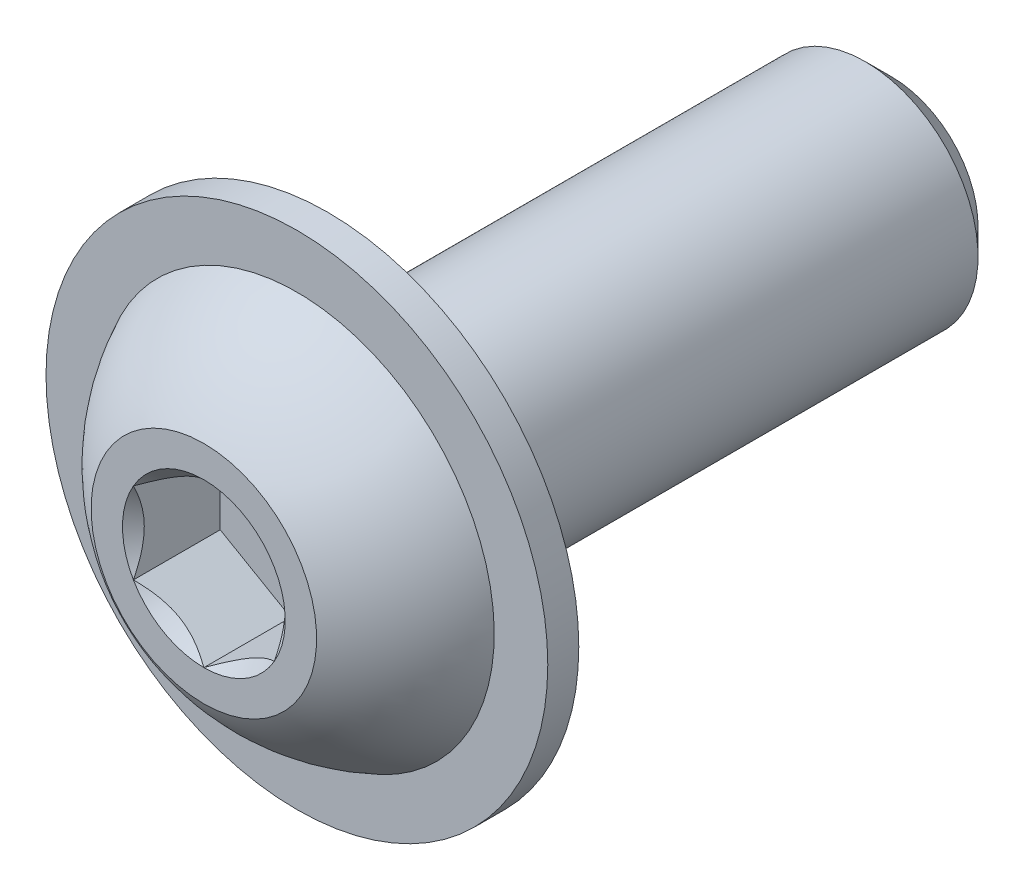
ISO-10303-21;
HEADER;
FILE_DESCRIPTION(('STEP AP214'),'2;1');
FILE_NAME('part.step','',(''),(''),'','','');
FILE_SCHEMA(('AUTOMOTIVE_DESIGN { 1 0 10303 214 1 1 1 1 }'));
ENDSEC;
DATA;
#1=APPLICATION_CONTEXT('core data for automotive mechanical design processes');
#2=APPLICATION_PROTOCOL_DEFINITION('international standard','automotive_design',2000,#1);
#3=PRODUCT_CONTEXT('',#1,'mechanical');
#4=PRODUCT('Part','Part','',(#3));
#5=PRODUCT_RELATED_PRODUCT_CATEGORY('part','',(#4));
#6=PRODUCT_DEFINITION_FORMATION('','',#4);
#7=PRODUCT_DEFINITION_CONTEXT('part definition',#1,'design');
#8=PRODUCT_DEFINITION('design','',#6,#7);
#9=PRODUCT_DEFINITION_SHAPE('','',#8);
#10=(LENGTH_UNIT() NAMED_UNIT(*) SI_UNIT(.MILLI.,.METRE.));
#11=(NAMED_UNIT(*) PLANE_ANGLE_UNIT() SI_UNIT($,.RADIAN.));
#12=(NAMED_UNIT(*) SI_UNIT($,.STERADIAN.) SOLID_ANGLE_UNIT());
#13=UNCERTAINTY_MEASURE_WITH_UNIT(LENGTH_MEASURE(1.E-05),#10,'distance_accuracy_value','');
#14=(GEOMETRIC_REPRESENTATION_CONTEXT(3) GLOBAL_UNCERTAINTY_ASSIGNED_CONTEXT((#13)) GLOBAL_UNIT_ASSIGNED_CONTEXT((#10,
#11,#12)) REPRESENTATION_CONTEXT('',''));
#15=CARTESIAN_POINT('',(0.,0.,0.));
#16=DIRECTION('',(0.,0.,1.));
#17=DIRECTION('',(1.,0.,0.));
#18=AXIS2_PLACEMENT_3D('',#15,#16,#17);
#19=CARTESIAN_POINT('',(0.,-4.,-24.3999999999991));
#20=DIRECTION('',(0.,0.,-1.));
#21=DIRECTION('',(0.,1.,0.));
#22=AXIS2_PLACEMENT_3D('',#19,#20,#21);
#23=PLANE('',#22);
#24=CARTESIAN_POINT('',(0.,0.,-24.4));
#25=DIRECTION('',(0.,0.,-1.));
#26=DIRECTION('',(0.,1.,0.));
#27=AXIS2_PLACEMENT_3D('',#24,#25,#26);
#28=CIRCLE('',#27,3.06250000000001);
#29=CARTESIAN_POINT('',(0.,3.06250000000001,-24.4));
#30=VERTEX_POINT('',#29);
#31=EDGE_CURVE('E209',#30,#30,#28,.T.);
#32=ORIENTED_EDGE('',*,*,#31,.T.);
#33=EDGE_LOOP('',(#32));
#34=FACE_BOUND('',#33,.T.);
#35=ADVANCED_FACE('F40',(#34),#23,.T.);
#36=CARTESIAN_POINT('',(0.,0.,-24.4));
#37=DIRECTION('',(0.,0.,-1.));
#38=DIRECTION('',(0.,1.,0.));
#39=AXIS2_PLACEMENT_3D('',#36,#37,#38);
#40=CYLINDRICAL_SURFACE('',#39,4.);
#41=CARTESIAN_POINT('',(0.,0.,-23.4624999999999));
#42=DIRECTION('',(0.,0.,-1.));
#43=DIRECTION('',(0.,1.,0.));
#44=AXIS2_PLACEMENT_3D('',#41,#42,#43);
#45=CIRCLE('',#44,4.);
#46=CARTESIAN_POINT('',(0.,4.,-23.4624999999999));
#47=VERTEX_POINT('',#46);
#48=EDGE_CURVE('E55',#47,#47,#45,.F.);
#49=ORIENTED_EDGE('',*,*,#48,.T.);
#50=EDGE_LOOP('',(#49));
#51=FACE_BOUND('',#50,.T.);
#52=CARTESIAN_POINT('',(0.,0.,-4.39999999999996));
#53=DIRECTION('',(0.,0.,1.));
#54=DIRECTION('',(1.,0.,0.));
#55=AXIS2_PLACEMENT_3D('',#52,#53,#54);
#56=CIRCLE('',#55,4.);
#57=CARTESIAN_POINT('',(4.,0.,-4.39999999999996));
#58=VERTEX_POINT('',#57);
#59=EDGE_CURVE('E205',#58,#58,#56,.F.);
#60=ORIENTED_EDGE('',*,*,#59,.T.);
#61=EDGE_LOOP('',(#60));
#62=FACE_BOUND('',#61,.T.);
#63=ADVANCED_FACE('F217',(#51,#62),#40,.T.);
#64=CARTESIAN_POINT('',(0.,0.,-24.4));
#65=DIRECTION('',(0.,0.,1.));
#66=DIRECTION('',(0.,-1.,0.));
#67=AXIS2_PLACEMENT_3D('',#64,#65,#66);
#68=CONICAL_SURFACE('',#67,3.06250000000001,0.785398163397445);
#69=ORIENTED_EDGE('',*,*,#48,.F.);
#70=EDGE_LOOP('',(#69));
#71=FACE_BOUND('',#70,.T.);
#72=ORIENTED_EDGE('',*,*,#31,.F.);
#73=EDGE_LOOP('',(#72));
#74=FACE_BOUND('',#73,.T.);
#75=ADVANCED_FACE('F42',(#71,#74),#68,.T.);
#76=CARTESIAN_POINT('',(0.,-7.00000000000001,-4.40000000000085));
#77=DIRECTION('',(0.,0.,1.));
#78=DIRECTION('',(1.,0.,0.));
#79=AXIS2_PLACEMENT_3D('',#76,#77,#78);
#80=PLANE('',#79);
#81=ORIENTED_EDGE('',*,*,#59,.F.);
#82=EDGE_LOOP('',(#81));
#83=FACE_BOUND('',#82,.T.);
#84=CARTESIAN_POINT('',(0.,0.,-4.39999999999996));
#85=DIRECTION('',(0.,0.,-1.));
#86=DIRECTION('',(-1.,0.,0.));
#87=AXIS2_PLACEMENT_3D('',#84,#85,#86);
#88=CIRCLE('',#87,8.9);
#89=CARTESIAN_POINT('',(-8.9,0.,-4.39999999999996));
#90=VERTEX_POINT('',#89);
#91=EDGE_CURVE('E194',#90,#90,#88,.T.);
#92=ORIENTED_EDGE('',*,*,#91,.T.);
#93=EDGE_LOOP('',(#92));
#94=FACE_BOUND('',#93,.T.);
#95=ADVANCED_FACE('F222',(#83,#94),#80,.F.);
#96=CARTESIAN_POINT('',(0.,0.,-3.29999999999997));
#97=DIRECTION('',(0.,0.,-1.));
#98=DIRECTION('',(-1.,0.,0.));
#99=AXIS2_PLACEMENT_3D('',#96,#97,#98);
#100=PLANE('',#99);
#101=CARTESIAN_POINT('',(0.,0.,-3.29999999999997));
#102=DIRECTION('',(0.,0.,-1.));
#103=DIRECTION('',(-1.,0.,0.));
#104=AXIS2_PLACEMENT_3D('',#101,#102,#103);
#105=CIRCLE('',#104,8.9);
#106=CARTESIAN_POINT('',(-8.9,0.,-3.29999999999997));
#107=VERTEX_POINT('',#106);
#108=EDGE_CURVE('E189',#107,#107,#105,.T.);
#109=ORIENTED_EDGE('',*,*,#108,.F.);
#110=EDGE_LOOP('',(#109));
#111=FACE_BOUND('',#110,.T.);
#112=CARTESIAN_POINT('',(0.,0.,-3.29999999999997));
#113=DIRECTION('',(0.,0.,-1.));
#114=DIRECTION('',(-1.,0.,0.));
#115=AXIS2_PLACEMENT_3D('',#112,#113,#114);
#116=CIRCLE('',#115,7.);
#117=CARTESIAN_POINT('',(0.,-6.99999999999996,-3.29999999999997));
#118=VERTEX_POINT('',#117);
#119=EDGE_CURVE('E193',#118,#118,#116,.T.);
#120=ORIENTED_EDGE('',*,*,#119,.T.);
#121=EDGE_LOOP('',(#120));
#122=FACE_BOUND('',#121,.T.);
#123=ADVANCED_FACE('F240',(#111,#122),#100,.F.);
#124=CARTESIAN_POINT('',(0.,0.,-3.29999999999997));
#125=DIRECTION('',(0.,0.,-1.));
#126=DIRECTION('',(-1.,0.,0.));
#127=AXIS2_PLACEMENT_3D('',#124,#125,#126);
#128=CYLINDRICAL_SURFACE('',#127,8.9);
#129=ORIENTED_EDGE('',*,*,#108,.T.);
#130=EDGE_LOOP('',(#129));
#131=FACE_BOUND('',#130,.T.);
#132=ORIENTED_EDGE('',*,*,#91,.F.);
#133=EDGE_LOOP('',(#132));
#134=FACE_BOUND('',#133,.T.);
#135=ADVANCED_FACE('F237',(#131,#134),#128,.T.);
#136=CARTESIAN_POINT('',(0.,-4.,8.88178419700125E-13));
#137=DIRECTION('',(0.,0.,-1.));
#138=DIRECTION('',(-1.,0.,0.));
#139=AXIS2_PLACEMENT_3D('',#136,#137,#138);
#140=PLANE('',#139);
#141=CARTESIAN_POINT('',(0.,0.,0.));
#142=DIRECTION('',(0.,0.,1.));
#143=DIRECTION('',(1.,0.,0.));
#144=AXIS2_PLACEMENT_3D('',#141,#142,#143);
#145=CIRCLE('',#144,2.88675134594813);
#146=CARTESIAN_POINT('',(-2.50000000000011,1.44337567297405,-8.88178419700125E-13));
#147=VERTEX_POINT('',#146);
#148=CARTESIAN_POINT('',(-2.5,-1.44337567297408,8.88178419700125E-13));
#149=VERTEX_POINT('',#148);
#150=EDGE_CURVE('E68',#147,#149,#145,.T.);
#151=ORIENTED_EDGE('',*,*,#150,.F.);
#152=CARTESIAN_POINT('',(0.,2.88675134594816,8.88178419700125E-13));
#153=VERTEX_POINT('',#152);
#154=EDGE_CURVE('E146',#153,#147,#145,.T.);
#155=ORIENTED_EDGE('',*,*,#154,.F.);
#156=CARTESIAN_POINT('',(2.49999999999989,1.44337567297406,-8.88178419700125E-13));
#157=VERTEX_POINT('',#156);
#158=EDGE_CURVE('E140',#157,#153,#145,.T.);
#159=ORIENTED_EDGE('',*,*,#158,.F.);
#160=CARTESIAN_POINT('',(2.5,-1.44337567297407,8.88178419700125E-13));
#161=VERTEX_POINT('',#160);
#162=EDGE_CURVE('E109',#161,#157,#145,.T.);
#163=ORIENTED_EDGE('',*,*,#162,.F.);
#164=CARTESIAN_POINT('',(0.,-2.88675134594812,-8.88178419700125E-13));
#165=VERTEX_POINT('',#164);
#166=EDGE_CURVE('E100',#165,#161,#145,.T.);
#167=ORIENTED_EDGE('',*,*,#166,.F.);
#168=EDGE_CURVE('E61',#149,#165,#145,.T.);
#169=ORIENTED_EDGE('',*,*,#168,.F.);
#170=EDGE_LOOP('',(#151,#155,#159,#163,#167,#169));
#171=FACE_BOUND('',#170,.T.);
#172=CARTESIAN_POINT('',(0.,0.,0.));
#173=DIRECTION('',(0.,0.,1.));
#174=DIRECTION('',(1.,0.,0.));
#175=AXIS2_PLACEMENT_3D('',#172,#173,#174);
#176=CIRCLE('',#175,4.);
#177=CARTESIAN_POINT('',(0.,-3.99999999999992,0.));
#178=VERTEX_POINT('',#177);
#179=EDGE_CURVE('E201',#178,#178,#176,.T.);
#180=ORIENTED_EDGE('',*,*,#179,.T.);
#181=EDGE_LOOP('',(#180));
#182=FACE_BOUND('',#181,.T.);
#183=ADVANCED_FACE('F137',(#171,#182),#140,.F.);
#184=CARTESIAN_POINT('',(0.,0.,-6.65000000000004));
#185=DIRECTION('',(0.,0.,1.));
#186=DIRECTION('',(0.,-1.,0.));
#187=AXIS2_PLACEMENT_3D('',#184,#185,#186);
#188=SPHERICAL_SURFACE('',#187,7.76031571522705);
#189=CARTESIAN_POINT('',(0.,-3.99999999999992,0.));
#190=CARTESIAN_POINT('',(0.,-4.04037893719837,-0.0242880228539734));
#191=CARTESIAN_POINT('',(0.,-4.08053660493605,-0.0489439030561398));
#192=CARTESIAN_POINT('',(0.,-4.16039619582756,-0.0989830066171534));
#193=CARTESIAN_POINT('',(0.,-4.20009811898139,-0.124366229976001));
#194=CARTESIAN_POINT('',(0.,-4.2790330150429,-0.175851648310668));
#195=CARTESIAN_POINT('',(0.,-4.31826598795057,-0.201953843286489));
#196=CARTESIAN_POINT('',(0.,-4.39624997398239,-0.254868530081802));
#197=CARTESIAN_POINT('',(0.,-4.43500098710654,-0.281681021901295));
#198=CARTESIAN_POINT('',(0.,-4.51200819309826,-0.336007409250989));
#199=CARTESIAN_POINT('',(0.,-4.55026438596583,-0.363521304781191));
#200=CARTESIAN_POINT('',(0.,-4.62626925806947,-0.419241369039924));
#201=CARTESIAN_POINT('',(0.,-4.66401793730553,-0.447447537768455));
#202=CARTESIAN_POINT('',(0.,-4.73899525639249,-0.504542789448706));
#203=CARTESIAN_POINT('',(0.,-4.77622389624339,-0.533431872400427));
#204=CARTESIAN_POINT('',(0.,-4.85014878357225,-0.59188336661719));
#205=CARTESIAN_POINT('',(0.,-4.88684503105021,-0.621445777882233));
#206=CARTESIAN_POINT('',(0.,-4.9596929572454,-0.681234119484463));
#207=CARTESIAN_POINT('',(0.,-4.99584463596261,-0.71146004982165));
#208=CARTESIAN_POINT('',(0.,-5.06759142895973,-0.772565400137288));
#209=CARTESIAN_POINT('',(0.,-5.10318654323964,-0.803444820115739));
#210=CARTESIAN_POINT('',(0.,-5.17380839635813,-0.865846903451576));
#211=CARTESIAN_POINT('',(0.,-5.20883513519672,-0.897369566808963));
#212=CARTESIAN_POINT('',(0.,-5.27830861502532,-0.961047677200643));
#213=CARTESIAN_POINT('',(0.,-5.31275535601533,-0.993203124234936));
#214=CARTESIAN_POINT('',(0.,-5.38105741019139,-1.05813613231156));
#215=CARTESIAN_POINT('',(0.,-5.41491272337744,-1.09091369335389));
#216=CARTESIAN_POINT('',(0.,-5.48202068823502,-1.15708005335065));
#217=CARTESIAN_POINT('',(0.,-5.51527333990657,-1.19046885230509));
#218=CARTESIAN_POINT('',(0.,-5.58116494799691,-1.25784660921207));
#219=CARTESIAN_POINT('',(0.,-5.61380390441571,-1.29183556716463));
#220=CARTESIAN_POINT('',(0.,-5.67845729189579,-1.36040236401193));
#221=CARTESIAN_POINT('',(0.,-5.71047172295708,-1.39498020290667));
#222=CARTESIAN_POINT('',(0.,-5.77386543684441,-1.46471328818274));
#223=CARTESIAN_POINT('',(0.,-5.80524471967046,-1.49986853456406));
#224=CARTESIAN_POINT('',(0.,-5.86735772496153,-1.57074476976501));
#225=CARTESIAN_POINT('',(0.,-5.89809144742654,-1.60646575858465));
#226=CARTESIAN_POINT('',(0.,-5.95890313407649,-1.67846162589199));
#227=CARTESIAN_POINT('',(0.,-5.98898109826144,-1.71473650437969));
#228=CARTESIAN_POINT('',(0.,-6.04847128802288,-1.78782811446386));
#229=CARTESIAN_POINT('',(0.,-6.07788351359938,-1.82464484606033));
#230=CARTESIAN_POINT('',(0.,-6.13603246671775,-1.89880794600757));
#231=CARTESIAN_POINT('',(0.,-6.16476919425962,-1.93615431435836));
#232=CARTESIAN_POINT('',(0.,-6.22155761602329,-2.01136429571816));
#233=CARTESIAN_POINT('',(0.,-6.24960931024508,-2.04922790872719));
#234=CARTESIAN_POINT('',(0.,-6.30501835738714,-2.12545981567796));
#235=CARTESIAN_POINT('',(0.,-6.33237571030742,-2.16382810961971));
#236=CARTESIAN_POINT('',(0.,-6.38638699725991,-2.24105664724864));
#237=CARTESIAN_POINT('',(0.,-6.41304093129213,-2.27991689093583));
#238=CARTESIAN_POINT('',(0.,-6.46563653628033,-2.35811643363532));
#239=CARTESIAN_POINT('',(0.,-6.49157820723631,-2.39745573264761));
#240=CARTESIAN_POINT('',(0.,-6.5427406782489,-2.47660033260644));
#241=CARTESIAN_POINT('',(0.,-6.5679614783055,-2.51640563355297));
#242=CARTESIAN_POINT('',(0.,-6.61767383879795,-2.59646902941006));
#243=CARTESIAN_POINT('',(0.,-6.64216539923378,-2.63672712432062));
#244=CARTESIAN_POINT('',(0.,-6.69041115408783,-2.71768274971534));
#245=CARTESIAN_POINT('',(0.,-6.71416534850605,-2.7583802801995));
#246=CARTESIAN_POINT('',(0.,-6.76092848828481,-2.84020127319734));
#247=CARTESIAN_POINT('',(0.,-6.78393743364536,-2.88132473571101));
#248=CARTESIAN_POINT('',(0.,-6.82920244445215,-2.96398394543817));
#249=CARTESIAN_POINT('',(0.,-6.8514585098984,-3.00551969265166));
#250=CARTESIAN_POINT('',(0.,-6.89521036155603,-3.08898969680803));
#251=CARTESIAN_POINT('',(0.,-6.91670614776741,-3.13092395375092));
#252=CARTESIAN_POINT('',(0.,-6.95893036213258,-3.21517703597225));
#253=CARTESIAN_POINT('',(0.,-6.97965879028636,-3.25749586125068));
#254=CARTESIAN_POINT('',(0.,-6.99999999999996,-3.29999999999997));
#255=B_SPLINE_CURVE_WITH_KNOTS('',3,(#189,#190,#191,#192,#193,#194,#195,#196,#197,#198,#199,
#200,#201,#202,#203,#204,#205,#206,#207,#208,#209,#210,#211,#212,#213,#214,#215,#216,#217,#218,
#219,#220,#221,#222,#223,#224,#225,#226,#227,#228,#229,#230,#231,#232,#233,#234,#235,#236,#237,
#238,#239,#240,#241,#242,#243,#244,#245,#246,#247,#248,#249,#250,#251,#252,#253,#254),
.UNSPECIFIED.,.F.,.F.,(4,2,2,2,2,2,2,2,2,2,2,2,2,2,2,2,2,2,2,2,2,2,2,2,2,2,2,2,2,2,2,2,4),(0.,
0.141360341936276,0.282720683872553,0.424081025808828,0.565441367745104,0.70680170968138,
0.848162051617657,0.989522393553932,1.13088273549021,1.27224307742648,1.41360341936276,
1.55496376129904,1.69632410323531,1.83768444517159,1.97904478710786,2.12040512904414,
2.26176547098042,2.40312581291669,2.54448615485297,2.68584649678925,2.82720683872552,
2.9685671806618,3.10992752259807,3.25128786453435,3.39264820647063,3.5340085484069,
3.67536889034318,3.81672923227945,3.95808957421573,4.099449916152,4.24081025808828,
4.38217060002456,4.52353094196083),.UNSPECIFIED.);
#256=EDGE_CURVE('BSEAM231',#178,#118,#255,.T.);
#257=ORIENTED_EDGE('',*,*,#179,.F.);
#258=ORIENTED_EDGE('',*,*,#119,.F.);
#259=ORIENTED_EDGE('',*,*,#256,.T.);
#260=ORIENTED_EDGE('',*,*,#256,.F.);
#261=EDGE_LOOP('',(#257,#259,#258,#260));
#262=FACE_BOUND('',#261,.T.);
#263=ADVANCED_FACE('F231',(#262),#188,.T.);
#264=CARTESIAN_POINT('',(0.,0.,0.));
#265=DIRECTION('',(0.,0.,1.));
#266=DIRECTION('',(1.,0.,0.));
#267=AXIS2_PLACEMENT_3D('',#264,#265,#266);
#268=CONICAL_SURFACE('',#267,2.88675134594813,0.78539816339745);
#269=ORIENTED_EDGE('',*,*,#162,.T.);
#270=CARTESIAN_POINT('',(2.49999999999995,-2.87868021616153,0.925964193783768));
#271=CARTESIAN_POINT('',(2.49999999999998,-2.80858751756327,0.873054769398976));
#272=CARTESIAN_POINT('',(2.5,-2.7381023738442,0.820656784806086));
#273=CARTESIAN_POINT('',(2.50000000000001,-2.59619238907424,0.717112683514978));
#274=CARTESIAN_POINT('',(2.5,-2.52476731657101,0.665966884377655));
#275=CARTESIAN_POINT('',(2.5,-2.38030019419654,0.564792497981109));
#276=CARTESIAN_POINT('',(2.5,-2.30724990359351,0.514775637784124));
#277=CARTESIAN_POINT('',(2.5,-2.15990937397237,0.416608843915139));
#278=CARTESIAN_POINT('',(2.5,-2.08561922308883,0.368458778345149));
#279=CARTESIAN_POINT('',(2.5,-1.93130274871346,0.271746559451584));
#280=CARTESIAN_POINT('',(2.5,-1.85119168497788,0.223318932536946));
#281=CARTESIAN_POINT('',(2.5,-1.68912282627111,0.129664059703807));
#282=CARTESIAN_POINT('',(2.5,-1.60716527674811,0.0844363916944692));
#283=CARTESIAN_POINT('',(2.5,-1.44137668632267,-0.0018646253309174));
#284=CARTESIAN_POINT('',(2.5,-1.35755175925741,-0.0429496273364084));
#285=CARTESIAN_POINT('',(2.5,-1.18761577759393,-0.12003813389378));
#286=CARTESIAN_POINT('',(2.5,-1.10150577924733,-0.15604393926639));
#287=CARTESIAN_POINT('',(2.5,-0.933895283730512,-0.219050255715741));
#288=CARTESIAN_POINT('',(2.5,-0.852581486652385,-0.246542279857143));
#289=CARTESIAN_POINT('',(2.5,-0.687996185051314,-0.2950028855824));
#290=CARTESIAN_POINT('',(2.5,-0.60472454608513,-0.315971017760989));
#291=CARTESIAN_POINT('',(2.50000000000001,-0.438105786501689,-0.349940004987016));
#292=CARTESIAN_POINT('',(2.50000000000002,-0.354786957377915,-0.36307736655639));
#293=CARTESIAN_POINT('',(2.49999999999999,-0.187258638268824,-0.381129805600387));
#294=CARTESIAN_POINT('',(2.49999999999995,-0.103049303891809,-0.386046296469852));
#295=CARTESIAN_POINT('',(2.49999999999995,0.0623819458554584,-0.38729192562813));
#296=CARTESIAN_POINT('',(2.49999999999999,0.143601667742413,-0.383925448289126));
#297=CARTESIAN_POINT('',(2.50000000000002,0.30534484053391,-0.369462407619084));
#298=CARTESIAN_POINT('',(2.50000000000001,0.385868223029619,-0.358365093346914));
#299=CARTESIAN_POINT('',(2.5,0.546999992477707,-0.328857921414663));
#300=CARTESIAN_POINT('',(2.49999999999999,0.627585258156355,-0.310323623169074));
#301=CARTESIAN_POINT('',(2.50000000000001,0.786991930978571,-0.266927667985948));
#302=CARTESIAN_POINT('',(2.50000000000005,0.865813485110817,-0.24206654048261));
#303=CARTESIAN_POINT('',(2.50000000000008,1.11399280220491,-0.154441088760227));
#304=CARTESIAN_POINT('',(2.50000000000002,1.27984027529454,-0.0816966645254097));
#305=CARTESIAN_POINT('',(2.49999999999999,1.52253018655035,0.0395423452678388));
#306=CARTESIAN_POINT('',(2.5,1.60256472908877,0.0820714512071933));
#307=CARTESIAN_POINT('',(2.5,1.76081489282122,0.170396524152179));
#308=CARTESIAN_POINT('',(2.5,1.83903083842885,0.216191902476703));
#309=CARTESIAN_POINT('',(2.5,1.9900068460717,0.308044678728662));
#310=CARTESIAN_POINT('',(2.5,2.0628447203045,0.353975635424493));
#311=CARTESIAN_POINT('',(2.5,2.20727164736148,0.447770245386598));
#312=CARTESIAN_POINT('',(2.5,2.27886060500418,0.495634045043748));
#313=CARTESIAN_POINT('',(2.5,2.42037078548428,0.592552236318488));
#314=CARTESIAN_POINT('',(2.5,2.49030083172909,0.641593798316355));
#315=CARTESIAN_POINT('',(2.5,2.62920524991588,0.740973835190077));
#316=CARTESIAN_POINT('',(2.5,2.69817987937863,0.791311949707866));
#317=CARTESIAN_POINT('',(2.5,2.76675463365827,0.842180297683237));
#318=B_SPLINE_CURVE_WITH_KNOTS('',3,(#270,#271,#272,#273,#274,#275,#276,#277,#278,#279,#280,
#281,#282,#283,#284,#285,#286,#287,#288,#289,#290,#291,#292,#293,#294,#295,#296,#297,#298,#299,
#300,#301,#302,#303,#304,#305,#306,#307,#308,#309,#310,#311,#312,#313,#314,#315,#316,#317),
.UNSPECIFIED.,.F.,.F.,(4,2,2,2,2,2,2,2,2,2,2,2,2,2,2,2,2,2,2,2,2,2,2,4),(0.,0.263465914971081,
0.526997968323202,0.792571943279461,1.05812711983793,1.33890112548033,1.61963802629085,
1.89956181222208,2.17935838571868,2.43663887682558,2.69393708705198,2.94660788173083,
3.19923523084958,3.44271854486731,3.68622551313309,3.93398926860523,4.18173229781918,
4.72334004841857,4.99521600381964,5.26704308216917,5.52534341671957,5.78366335141064,
6.03988492204037,6.29603603207544),.UNSPECIFIED.);
#319=EDGE_CURVE('E11',#161,#157,#318,.T.);
#320=ORIENTED_EDGE('',*,*,#319,.F.);
#321=EDGE_LOOP('',(#269,#320));
#322=FACE_BOUND('',#321,.T.);
#323=ADVANCED_FACE('F113',(#322),#268,.F.);
#324=ORIENTED_EDGE('',*,*,#158,.T.);
#325=CARTESIAN_POINT('',(2.5001999999999,1.44326020292022,0.000115476980866447));
#326=CARTESIAN_POINT('',(2.41426172221201,1.4928766907347,-0.0494592946458244));
#327=CARTESIAN_POINT('',(2.32688643272399,1.54332283764112,-0.096122518637811));
#328=CARTESIAN_POINT('',(2.14871854383426,1.64618811625255,-0.181561859961724));
#329=CARTESIAN_POINT('',(2.05790899931892,1.69861703122348,-0.220290437593975));
#330=CARTESIAN_POINT('',(1.87479587687323,1.80433744175963,-0.286633296102404));
#331=CARTESIAN_POINT('',(1.78253893547082,1.85760201171289,-0.314414331469484));
#332=CARTESIAN_POINT('',(1.59599399122384,1.96530378548994,-0.357216824089123));
#333=CARTESIAN_POINT('',(1.50171168743379,2.01973769896305,-0.372270233327693));
#334=CARTESIAN_POINT('',(1.33922174170813,2.11355131286833,-0.385852277789835));
#335=CARTESIAN_POINT('',(1.27122403211978,2.15280980880335,-0.387862900759099));
#336=CARTESIAN_POINT('',(1.13533975883066,2.2312626305654,-0.38447588281283));
#337=CARTESIAN_POINT('',(1.06745324244764,2.27045692907351,-0.379075644700334));
#338=CARTESIAN_POINT('',(0.932321211763779,2.34847544336499,-0.361174211597577));
#339=CARTESIAN_POINT('',(0.865076500246328,2.38729919566115,-0.348665072953631));
#340=CARTESIAN_POINT('',(0.731749899181733,2.46427534467596,-0.317232498044382));
#341=CARTESIAN_POINT('',(0.665667920900315,2.50242779262538,-0.298309553503184));
#342=CARTESIAN_POINT('',(0.4964036533087,2.60015256308363,-0.242132638591658));
#343=CARTESIAN_POINT('',(0.394270877776981,2.65911894852986,-0.200644168403784));
#344=CARTESIAN_POINT('',(0.244093585059233,2.74582384890658,-0.130605953276968));
#345=CARTESIAN_POINT('',(0.194603460117082,2.77439698586415,-0.105997747884004));
#346=CARTESIAN_POINT('',(0.0965399361608538,2.831013987818,-0.0545381132846237));
#347=CARTESIAN_POINT('',(0.0479659965028322,2.85905816495519,-0.0276880612202618));
#348=CARTESIAN_POINT('',(-0.000200000000061262,2.88686681600198,0.000115476982642804));
#349=B_SPLINE_CURVE_WITH_KNOTS('',3,(#325,#326,#327,#328,#329,#330,#331,#332,#333,#334,#335,
#336,#337,#338,#339,#340,#341,#342,#343,#344,#345,#346,#347,#348),.UNSPECIFIED.,.F.,.F.,(4,2,2,
2,2,2,2,2,2,2,2,4),(0.,0.333012085133742,0.66796451830077,0.997597032042642,1.32639954393789,
1.56169424147123,1.79707142102041,2.03271213522123,2.26833478775603,2.642602408095,
2.82922877818843,3.01574133749021),.UNSPECIFIED.);
#350=EDGE_CURVE('E145',#157,#153,#349,.T.);
#351=ORIENTED_EDGE('',*,*,#350,.F.);
#352=EDGE_LOOP('',(#324,#351));
#353=FACE_BOUND('',#352,.T.);
#354=ADVANCED_FACE('F340',(#353),#268,.F.);
#355=ORIENTED_EDGE('',*,*,#154,.T.);
#356=CARTESIAN_POINT('',(0.00019999999995024,2.88686681600198,0.000115476982642804));
#357=CARTESIAN_POINT('',(-0.085738277787672,2.83725032818757,-0.0494592946448255));
#358=CARTESIAN_POINT('',(-0.173113567275631,2.78680418128116,-0.0961225186373144));
#359=CARTESIAN_POINT('',(-0.351281456165574,2.6839389026696,-0.18156185996183));
#360=CARTESIAN_POINT('',(-0.442091000681202,2.63150998769852,-0.220290437594165));
#361=CARTESIAN_POINT('',(-0.625204123127201,2.52578957716217,-0.28663329610226));
#362=CARTESIAN_POINT('',(-0.717461064529629,2.47252500720885,-0.314414331468955));
#363=CARTESIAN_POINT('',(-0.904006008776503,2.36482323343198,-0.357216824089654));
#364=CARTESIAN_POINT('',(-0.99828831256642,2.31038931995909,-0.372270233329675));
#365=CARTESIAN_POINT('',(-1.1607782582919,2.21657570605387,-0.385852277791272));
#366=CARTESIAN_POINT('',(-1.22877596788018,2.17731721011877,-0.387862900759405));
#367=CARTESIAN_POINT('',(-1.36466024116921,2.09886438835668,-0.384475882812318));
#368=CARTESIAN_POINT('',(-1.43254675755221,2.05967008984861,-0.379075644700132));
#369=CARTESIAN_POINT('',(-1.56767878823609,1.98165157555716,-0.361174211597594));
#370=CARTESIAN_POINT('',(-1.63492349975357,1.94282782326098,-0.34866507295355));
#371=CARTESIAN_POINT('',(-1.7682501008182,1.86585167424612,-0.317232498044272));
#372=CARTESIAN_POINT('',(-1.83433207909962,1.82769922629669,-0.298309553503146));
#373=CARTESIAN_POINT('',(-2.0035963466912,1.72997445583847,-0.24213263859174));
#374=CARTESIAN_POINT('',(-2.10572912222288,1.67100807039228,-0.200644168403873));
#375=CARTESIAN_POINT('',(-2.25590641494044,1.58430317001567,-0.130605953276925));
#376=CARTESIAN_POINT('',(-2.30539653988248,1.55573003305814,-0.105997747883902));
#377=CARTESIAN_POINT('',(-2.40346006383872,1.49911303110432,-0.0545381132849286));
#378=CARTESIAN_POINT('',(-2.45203400349686,1.4710688539671,-0.0276880612210332));
#379=CARTESIAN_POINT('',(-2.50020000000012,1.44326020292021,0.000115476980866447));
#380=B_SPLINE_CURVE_WITH_KNOTS('',3,(#356,#357,#358,#359,#360,#361,#362,#363,#364,#365,#366,
#367,#368,#369,#370,#371,#372,#373,#374,#375,#376,#377,#378,#379),.UNSPECIFIED.,.F.,.F.,(4,2,2,
2,2,2,2,2,2,2,2,4),(0.,0.333012085134142,0.667964518302059,0.997597032043957,1.32639954393898,
1.56169424147213,1.79707142102122,2.03271213522215,2.26833478775696,2.64260240809572,
2.82922877818892,3.01574133749039),.UNSPECIFIED.);
#381=EDGE_CURVE('E153',#153,#147,#380,.T.);
#382=ORIENTED_EDGE('',*,*,#381,.F.);
#383=EDGE_LOOP('',(#355,#382));
#384=FACE_BOUND('',#383,.T.);
#385=ADVANCED_FACE('F162',(#384),#268,.F.);
#386=ORIENTED_EDGE('',*,*,#150,.T.);
#387=CARTESIAN_POINT('',(-2.50000000000006,-2.87868021616153,0.925964193783768));
#388=CARTESIAN_POINT('',(-2.50000000000009,-2.80858751756326,0.873054769399011));
#389=CARTESIAN_POINT('',(-2.50000000000011,-2.73810237384418,0.820656784806138));
#390=CARTESIAN_POINT('',(-2.50000000000012,-2.59619238907422,0.717112683515045));
#391=CARTESIAN_POINT('',(-2.50000000000011,-2.52476731657099,0.665966884377721));
#392=CARTESIAN_POINT('',(-2.50000000000011,-2.38030019419652,0.564792497981173));
#393=CARTESIAN_POINT('',(-2.50000000000011,-2.30724990359348,0.514775637784189));
#394=CARTESIAN_POINT('',(-2.50000000000011,-2.15990937397234,0.416608843915202));
#395=CARTESIAN_POINT('',(-2.50000000000011,-2.08561922308879,0.36845877834521));
#396=CARTESIAN_POINT('',(-2.50000000000011,-1.93130274871342,0.271746559451645));
#397=CARTESIAN_POINT('',(-2.50000000000012,-1.85119168497784,0.223318932537007));
#398=CARTESIAN_POINT('',(-2.50000000000011,-1.68912282627105,0.129664059703866));
#399=CARTESIAN_POINT('',(-2.5000000000001,-1.60716527674805,0.084436391694524));
#400=CARTESIAN_POINT('',(-2.50000000000012,-1.4413766863226,-0.00186462533084646));
#401=CARTESIAN_POINT('',(-2.50000000000014,-1.35755175925734,-0.0429496273363177));
#402=CARTESIAN_POINT('',(-2.50000000000008,-1.18761577759388,-0.120038133893729));
#403=CARTESIAN_POINT('',(-2.5,-1.1015057792473,-0.156043939266398));
#404=CARTESIAN_POINT('',(-2.50000000000001,-0.933895283730494,-0.219050255715733));
#405=CARTESIAN_POINT('',(-2.50000000000009,-0.85258148665235,-0.246542279857071));
#406=CARTESIAN_POINT('',(-2.50000000000014,-0.687996185051266,-0.295002885582284));
#407=CARTESIAN_POINT('',(-2.50000000000012,-0.604724546085088,-0.315971017760893));
#408=CARTESIAN_POINT('',(-2.50000000000011,-0.438105786501649,-0.349940004986911));
#409=CARTESIAN_POINT('',(-2.50000000000013,-0.354786957377873,-0.363077366556258));
#410=CARTESIAN_POINT('',(-2.5000000000001,-0.187258638268788,-0.381129805600308));
#411=CARTESIAN_POINT('',(-2.50000000000006,-0.103049303891781,-0.386046296469854));
#412=CARTESIAN_POINT('',(-2.50000000000006,0.0623819458554694,-0.387291925628127));
#413=CARTESIAN_POINT('',(-2.5000000000001,0.143601667742415,-0.383925448289043));
#414=CARTESIAN_POINT('',(-2.50000000000013,0.305344840533901,-0.369462407618946));
#415=CARTESIAN_POINT('',(-2.50000000000011,0.38586822302961,-0.358365093346803));
#416=CARTESIAN_POINT('',(-2.50000000000012,0.546999992477691,-0.328857921414561));
#417=CARTESIAN_POINT('',(-2.50000000000015,0.627585258156332,-0.310323623168953));
#418=CARTESIAN_POINT('',(-2.50000000000008,0.786991930978552,-0.266927667985866));
#419=CARTESIAN_POINT('',(-2.49999999999998,0.86581348511081,-0.242066540482585));
#420=CARTESIAN_POINT('',(-2.49999999999987,1.11399280220491,-0.154441088760279));
#421=CARTESIAN_POINT('',(-2.50000000000007,1.27984027529449,-0.0816966645253607));
#422=CARTESIAN_POINT('',(-2.50000000000014,1.52253018655029,0.0395423452679163));
#423=CARTESIAN_POINT('',(-2.50000000000012,1.60256472908871,0.0820714512072613));
#424=CARTESIAN_POINT('',(-2.50000000000011,1.76081489282118,0.170396524152239));
#425=CARTESIAN_POINT('',(-2.50000000000011,1.8390308384288,0.216191902476763));
#426=CARTESIAN_POINT('',(-2.50000000000012,1.99000684607166,0.308044678728723));
#427=CARTESIAN_POINT('',(-2.50000000000011,2.06284472030446,0.353975635424555));
#428=CARTESIAN_POINT('',(-2.50000000000011,2.20727164736145,0.44777024538666));
#429=CARTESIAN_POINT('',(-2.50000000000011,2.27886060500415,0.49563404504381));
#430=CARTESIAN_POINT('',(-2.50000000000012,2.42037078548425,0.592552236318549));
#431=CARTESIAN_POINT('',(-2.50000000000012,2.49030083172905,0.641593798316415));
#432=CARTESIAN_POINT('',(-2.5000000000001,2.62920524991585,0.740973835190122));
#433=CARTESIAN_POINT('',(-2.50000000000007,2.6981798793786,0.791311949707896));
#434=CARTESIAN_POINT('',(-2.5,2.76675463365825,0.842180297683237));
#435=B_SPLINE_CURVE_WITH_KNOTS('',3,(#387,#388,#389,#390,#391,#392,#393,#394,#395,#396,#397,
#398,#399,#400,#401,#402,#403,#404,#405,#406,#407,#408,#409,#410,#411,#412,#413,#414,#415,#416,
#417,#418,#419,#420,#421,#422,#423,#424,#425,#426,#427,#428,#429,#430,#431,#432,#433,#434),
.UNSPECIFIED.,.F.,.F.,(4,2,2,2,2,2,2,2,2,2,2,2,2,2,2,2,2,2,2,2,2,2,2,4),(0.,0.263465914971069,
0.526997968323181,0.792571943279453,1.05812711983793,1.33890112548034,1.61963802629087,
1.8995618122221,2.17935838571868,2.43663887682558,2.69393708705198,2.94660788173082,
3.19923523084956,3.44271854486727,3.68622551313304,3.93398926860517,4.1817322978191,
4.72334004841847,4.99521600381955,5.26704308216908,5.52534341671949,5.78366335141056,
6.03988492204028,6.29603603207534),.UNSPECIFIED.);
#436=EDGE_CURVE('E167',#147,#149,#435,.F.);
#437=ORIENTED_EDGE('',*,*,#436,.F.);
#438=EDGE_LOOP('',(#386,#437));
#439=FACE_BOUND('',#438,.T.);
#440=ADVANCED_FACE('F334',(#439),#268,.F.);
#441=ORIENTED_EDGE('',*,*,#168,.T.);
#442=CARTESIAN_POINT('',(-2.50020000000001,-1.44326020292024,0.000115476982642804));
#443=CARTESIAN_POINT('',(-2.41426172221238,-1.49287669073465,-0.0494592946447764));
#444=CARTESIAN_POINT('',(-2.32688643272443,-1.54332283764105,-0.0961225186372471));
#445=CARTESIAN_POINT('',(-2.14871854383449,-1.64618811625261,-0.181561859961751));
#446=CARTESIAN_POINT('',(-2.05790899931887,-1.69861703122368,-0.220290437594092));
#447=CARTESIAN_POINT('',(-1.87479587687288,-1.80433744176003,-0.286633296102179));
#448=CARTESIAN_POINT('',(-1.78253893547045,-1.85760201171335,-0.314414331468859));
#449=CARTESIAN_POINT('',(-1.59599399122359,-1.96530378549021,-0.357216824089603));
#450=CARTESIAN_POINT('',(-1.50171168743369,-2.0197376989631,-0.372270233329683));
#451=CARTESIAN_POINT('',(-1.33922174170821,-2.11355131286832,-0.385852277791267));
#452=CARTESIAN_POINT('',(-1.27122403211992,-2.15280980880343,-0.387862900759359));
#453=CARTESIAN_POINT('',(-1.13533975883087,-2.23126263056551,-0.384475882812247));
#454=CARTESIAN_POINT('',(-1.06745324244785,-2.27045692907358,-0.379075644700076));
#455=CARTESIAN_POINT('',(-0.932321211763971,-2.34847544336506,-0.361174211597541));
#456=CARTESIAN_POINT('',(-0.865076500246497,-2.38729919566126,-0.348665072953484));
#457=CARTESIAN_POINT('',(-0.731749899181819,-2.46427534467608,-0.317232498044229));
#458=CARTESIAN_POINT('',(-0.665667920900341,-2.50242779262545,-0.298309553503139));
#459=CARTESIAN_POINT('',(-0.496403653308742,-2.60015256308363,-0.242132638591757));
#460=CARTESIAN_POINT('',(-0.394270877777148,-2.65911894852991,-0.200644168403835));
#461=CARTESIAN_POINT('',(-0.244093585059632,-2.74582384890656,-0.130605953276885));
#462=CARTESIAN_POINT('',(-0.194603460117581,-2.77439698586408,-0.105997747883874));
#463=CARTESIAN_POINT('',(-0.0965399361613474,-2.83101398781788,-0.0545381132848954));
#464=CARTESIAN_POINT('',(-0.0479659965032207,-2.85905816495508,-0.0276880612209827));
#465=CARTESIAN_POINT('',(0.000200000000005751,-2.88686681600196,0.000115476980977469));
#466=B_SPLINE_CURVE_WITH_KNOTS('',3,(#442,#443,#444,#445,#446,#447,#448,#449,#450,#451,#452,
#453,#454,#455,#456,#457,#458,#459,#460,#461,#462,#463,#464,#465),.UNSPECIFIED.,.F.,.F.,(4,2,2,
2,2,2,2,2,2,2,2,4),(0.,0.333012085134099,0.667964518302,0.997597032043892,1.3263995439389,
1.56169424147207,1.79707142102119,2.03271213522215,2.26833478775698,2.64260240809569,
2.82922877818888,3.01574133749034),.UNSPECIFIED.);
#467=EDGE_CURVE('E126',#149,#165,#466,.T.);
#468=ORIENTED_EDGE('',*,*,#467,.F.);
#469=EDGE_LOOP('',(#441,#468));
#470=FACE_BOUND('',#469,.T.);
#471=ADVANCED_FACE('F270',(#470),#268,.F.);
#472=ORIENTED_EDGE('',*,*,#166,.T.);
#473=CARTESIAN_POINT('',(-0.000200000000005751,-2.88686681600196,0.000115476980977469));
#474=CARTESIAN_POINT('',(0.0857382777878361,-2.83725032818747,-0.0494592946456601));
#475=CARTESIAN_POINT('',(0.173113567275808,-2.78680418128107,-0.0961225186376237));
#476=CARTESIAN_POINT('',(0.35128145616548,-2.68393890266968,-0.181561859961526));
#477=CARTESIAN_POINT('',(0.442091000680817,-2.63150998769876,-0.220290437593785));
#478=CARTESIAN_POINT('',(0.625204123126537,-2.52578957716257,-0.286633296102223));
#479=CARTESIAN_POINT('',(0.717461064528986,-2.47252500720925,-0.314414331469296));
#480=CARTESIAN_POINT('',(0.904006008776078,-2.36482323343223,-0.357216824089036));
#481=CARTESIAN_POINT('',(0.998288312566193,-2.31038931995918,-0.372270233327717));
#482=CARTESIAN_POINT('',(1.16077825829184,-2.21657570605387,-0.385852277789814));
#483=CARTESIAN_POINT('',(1.22877596788014,-2.17731721011879,-0.387862900758992));
#484=CARTESIAN_POINT('',(1.36466024116922,-2.09886438835671,-0.384475882812703));
#485=CARTESIAN_POINT('',(1.43254675755227,-2.05967008984862,-0.37907564470027));
#486=CARTESIAN_POINT('',(1.56767878823609,-1.98165157555716,-0.361174211597422));
#487=CARTESIAN_POINT('',(1.63492349975347,-1.94282782326101,-0.348665072953322));
#488=CARTESIAN_POINT('',(1.76825010081813,-1.86585167424623,-0.317232498044514));
#489=CARTESIAN_POINT('',(1.83433207909969,-1.82769922629684,-0.298309553503913));
#490=CARTESIAN_POINT('',(2.00359634669138,-1.72997445583863,-0.242132638592771));
#491=CARTESIAN_POINT('',(2.1057291222228,-1.67100807039239,-0.200644168404008));
#492=CARTESIAN_POINT('',(2.25590641494049,-1.58430317001563,-0.130605953276839));
#493=CARTESIAN_POINT('',(2.30539653988269,-1.55573003305803,-0.105997747883913));
#494=CARTESIAN_POINT('',(2.40346006383902,-1.49911303110417,-0.0545381132846356));
#495=CARTESIAN_POINT('',(2.4520340034971,-1.47106885396698,-0.0276880612203408));
#496=CARTESIAN_POINT('',(2.50020000000001,-1.44326020292023,0.000115476982642804));
#497=B_SPLINE_CURVE_WITH_KNOTS('',3,(#473,#474,#475,#476,#477,#478,#479,#480,#481,#482,#483,
#484,#485,#486,#487,#488,#489,#490,#491,#492,#493,#494,#495,#496),.UNSPECIFIED.,.F.,.F.,(4,2,2,
2,2,2,2,2,2,2,2,4),(0.,0.333012085133581,0.667964518300569,0.997597032042626,1.32639954393798,
1.56169424147126,1.79707142102044,2.0327121352212,2.26833478775586,2.6426024080949,
2.82922877818846,3.01574133749029),.UNSPECIFIED.);
#498=EDGE_CURVE('E104',#165,#161,#497,.T.);
#499=ORIENTED_EDGE('',*,*,#498,.F.);
#500=EDGE_LOOP('',(#472,#499));
#501=FACE_BOUND('',#500,.T.);
#502=ADVANCED_FACE('F102',(#501),#268,.F.);
#503=CARTESIAN_POINT('',(2.5,-1.44337567297414,-3.07999999999919));
#504=DIRECTION('',(0.,0.,1.));
#505=DIRECTION('',(1.,0.,0.));
#506=AXIS2_PLACEMENT_3D('',#503,#504,#505);
#507=PLANE('',#506);
#508=DIRECTION('',(0.866025403784438,0.5,0.));
#509=VECTOR('',#508,1.);
#510=CARTESIAN_POINT('',(0.,-2.88675134594814,-3.08000000000086));
#511=LINE('',#510,#509);
#512=CARTESIAN_POINT('',(0.,-2.88675134594814,-3.08000000000086));
#513=VERTEX_POINT('',#512);
#514=CARTESIAN_POINT('',(2.5,-1.44337567297414,-3.07999999999919));
#515=VERTEX_POINT('',#514);
#516=EDGE_CURVE('E125',#513,#515,#511,.T.);
#517=ORIENTED_EDGE('',*,*,#516,.T.);
#518=DIRECTION('',(0.,1.,0.));
#519=VECTOR('',#518,1.);
#520=CARTESIAN_POINT('',(2.5,-1.44337567297414,-3.07999999999919));
#521=LINE('',#520,#519);
#522=CARTESIAN_POINT('',(2.49999999999989,1.443375672974,-3.08000000000086));
#523=VERTEX_POINT('',#522);
#524=EDGE_CURVE('E130',#515,#523,#521,.T.);
#525=ORIENTED_EDGE('',*,*,#524,.T.);
#526=DIRECTION('',(-0.866025403784439,0.5,0.));
#527=VECTOR('',#526,1.);
#528=CARTESIAN_POINT('',(2.49999999999989,1.443375672974,-3.08000000000086));
#529=LINE('',#528,#527);
#530=CARTESIAN_POINT('',(0.,2.88675134594809,-3.07999999999919));
#531=VERTEX_POINT('',#530);
#532=EDGE_CURVE('E316',#523,#531,#529,.T.);
#533=ORIENTED_EDGE('',*,*,#532,.T.);
#534=DIRECTION('',(-0.866025403784438,-0.5,0.));
#535=VECTOR('',#534,1.);
#536=CARTESIAN_POINT('',(0.,2.88675134594809,-3.07999999999919));
#537=LINE('',#536,#535);
#538=CARTESIAN_POINT('',(-2.50000000000011,1.443375672974,-3.08000000000086));
#539=VERTEX_POINT('',#538);
#540=EDGE_CURVE('E176',#531,#539,#537,.T.);
#541=ORIENTED_EDGE('',*,*,#540,.T.);
#542=DIRECTION('',(0.,-1.,0.));
#543=VECTOR('',#542,1.);
#544=CARTESIAN_POINT('',(-2.50000000000011,1.443375672974,-3.08000000000086));
#545=LINE('',#544,#543);
#546=CARTESIAN_POINT('',(-2.5,-1.44337567297412,-3.07999999999919));
#547=VERTEX_POINT('',#546);
#548=EDGE_CURVE('E323',#539,#547,#545,.T.);
#549=ORIENTED_EDGE('',*,*,#548,.T.);
#550=DIRECTION('',(0.866025403784439,-0.5,0.));
#551=VECTOR('',#550,1.);
#552=CARTESIAN_POINT('',(-2.5,-1.44337567297412,-3.07999999999919));
#553=LINE('',#552,#551);
#554=EDGE_CURVE('E134',#547,#513,#553,.T.);
#555=ORIENTED_EDGE('',*,*,#554,.T.);
#556=EDGE_LOOP('',(#517,#525,#533,#541,#549,#555));
#557=FACE_BOUND('',#556,.T.);
#558=ADVANCED_FACE('F269',(#557),#507,.T.);
#559=CARTESIAN_POINT('',(2.5,-1.44337567297414,-3.07999999999919));
#560=DIRECTION('',(1.,0.,0.));
#561=DIRECTION('',(0.,0.,-1.));
#562=AXIS2_PLACEMENT_3D('',#559,#560,#561);
#563=PLANE('',#562);
#564=DIRECTION('',(0.,0.,1.));
#565=VECTOR('',#564,1.);
#566=CARTESIAN_POINT('',(2.5,-1.44337567297414,-3.07999999999919));
#567=LINE('',#566,#565);
#568=EDGE_CURVE('E121',#515,#161,#567,.T.);
#569=ORIENTED_EDGE('',*,*,#568,.T.);
#570=ORIENTED_EDGE('',*,*,#319,.T.);
#571=DIRECTION('',(0.,0.,1.));
#572=VECTOR('',#571,1.);
#573=CARTESIAN_POINT('',(2.49999999999989,1.443375672974,-3.08000000000086));
#574=LINE('',#573,#572);
#575=EDGE_CURVE('E133',#523,#157,#574,.T.);
#576=ORIENTED_EDGE('',*,*,#575,.F.);
#577=ORIENTED_EDGE('',*,*,#524,.F.);
#578=EDGE_LOOP('',(#569,#570,#576,#577));
#579=FACE_BOUND('',#578,.T.);
#580=ADVANCED_FACE('F128',(#579),#563,.F.);
#581=CARTESIAN_POINT('',(2.49999999999989,1.443375672974,-3.08000000000086));
#582=DIRECTION('',(0.5,0.866025403784439,0.));
#583=DIRECTION('',(-0.866025403784439,0.5,0.));
#584=AXIS2_PLACEMENT_3D('',#581,#582,#583);
#585=PLANE('',#584);
#586=ORIENTED_EDGE('',*,*,#575,.T.);
#587=ORIENTED_EDGE('',*,*,#350,.T.);
#588=DIRECTION('',(0.,0.,1.));
#589=VECTOR('',#588,1.);
#590=CARTESIAN_POINT('',(0.,2.88675134594809,-3.07999999999919));
#591=LINE('',#590,#589);
#592=EDGE_CURVE('E172',#531,#153,#591,.T.);
#593=ORIENTED_EDGE('',*,*,#592,.F.);
#594=ORIENTED_EDGE('',*,*,#532,.F.);
#595=EDGE_LOOP('',(#586,#587,#593,#594));
#596=FACE_BOUND('',#595,.T.);
#597=ADVANCED_FACE('F170',(#596),#585,.F.);
#598=CARTESIAN_POINT('',(0.,2.88675134594809,-3.07999999999919));
#599=DIRECTION('',(-0.5,0.866025403784438,0.));
#600=DIRECTION('',(-0.866025403784439,-0.5,0.));
#601=AXIS2_PLACEMENT_3D('',#598,#599,#600);
#602=PLANE('',#601);
#603=ORIENTED_EDGE('',*,*,#592,.T.);
#604=ORIENTED_EDGE('',*,*,#381,.T.);
#605=DIRECTION('',(0.,0.,1.));
#606=VECTOR('',#605,1.);
#607=CARTESIAN_POINT('',(-2.50000000000011,1.443375672974,-3.08000000000086));
#608=LINE('',#607,#606);
#609=EDGE_CURVE('E179',#539,#147,#608,.T.);
#610=ORIENTED_EDGE('',*,*,#609,.F.);
#611=ORIENTED_EDGE('',*,*,#540,.F.);
#612=EDGE_LOOP('',(#603,#604,#610,#611));
#613=FACE_BOUND('',#612,.T.);
#614=ADVANCED_FACE('F174',(#613),#602,.F.);
#615=CARTESIAN_POINT('',(-2.50000000000011,1.443375672974,-3.08000000000086));
#616=DIRECTION('',(-1.,0.,0.));
#617=DIRECTION('',(0.,0.,1.));
#618=AXIS2_PLACEMENT_3D('',#615,#616,#617);
#619=PLANE('',#618);
#620=ORIENTED_EDGE('',*,*,#609,.T.);
#621=ORIENTED_EDGE('',*,*,#436,.T.);
#622=DIRECTION('',(0.,0.,1.));
#623=VECTOR('',#622,1.);
#624=CARTESIAN_POINT('',(-2.5,-1.44337567297412,-3.07999999999919));
#625=LINE('',#624,#623);
#626=EDGE_CURVE('E184',#547,#149,#625,.T.);
#627=ORIENTED_EDGE('',*,*,#626,.F.);
#628=ORIENTED_EDGE('',*,*,#548,.F.);
#629=EDGE_LOOP('',(#620,#621,#627,#628));
#630=FACE_BOUND('',#629,.T.);
#631=ADVANCED_FACE('F292',(#630),#619,.F.);
#632=CARTESIAN_POINT('',(-2.5,-1.44337567297412,-3.07999999999919));
#633=DIRECTION('',(-0.5,-0.866025403784439,0.));
#634=DIRECTION('',(0.866025403784439,-0.5,0.));
#635=AXIS2_PLACEMENT_3D('',#632,#633,#634);
#636=PLANE('',#635);
#637=ORIENTED_EDGE('',*,*,#626,.T.);
#638=ORIENTED_EDGE('',*,*,#467,.T.);
#639=DIRECTION('',(0.,0.,1.));
#640=VECTOR('',#639,1.);
#641=CARTESIAN_POINT('',(0.,-2.88675134594814,-3.08000000000086));
#642=LINE('',#641,#640);
#643=EDGE_CURVE('E123',#513,#165,#642,.T.);
#644=ORIENTED_EDGE('',*,*,#643,.F.);
#645=ORIENTED_EDGE('',*,*,#554,.F.);
#646=EDGE_LOOP('',(#637,#638,#644,#645));
#647=FACE_BOUND('',#646,.T.);
#648=ADVANCED_FACE('F250',(#647),#636,.F.);
#649=CARTESIAN_POINT('',(0.,-2.88675134594814,-3.08000000000086));
#650=DIRECTION('',(0.5,-0.866025403784438,0.));
#651=DIRECTION('',(0.866025403784439,0.5,0.));
#652=AXIS2_PLACEMENT_3D('',#649,#650,#651);
#653=PLANE('',#652);
#654=ORIENTED_EDGE('',*,*,#643,.T.);
#655=ORIENTED_EDGE('',*,*,#498,.T.);
#656=ORIENTED_EDGE('',*,*,#568,.F.);
#657=ORIENTED_EDGE('',*,*,#516,.F.);
#658=EDGE_LOOP('',(#654,#655,#656,#657));
#659=FACE_BOUND('',#658,.T.);
#660=ADVANCED_FACE('F119',(#659),#653,.F.);
#661=CLOSED_SHELL('',(#35,#63,#75,#95,#123,#135,#183,#263,#323,#354,#385,#440,#471,#502,#558,
#580,#597,#614,#631,#648,#660));
#662=MANIFOLD_SOLID_BREP('B2',#661);
#663=ADVANCED_BREP_SHAPE_REPRESENTATION('',(#18,#662),#14);
#664=SHAPE_DEFINITION_REPRESENTATION(#9,#663);
ENDSEC;
END-ISO-10303-21;
